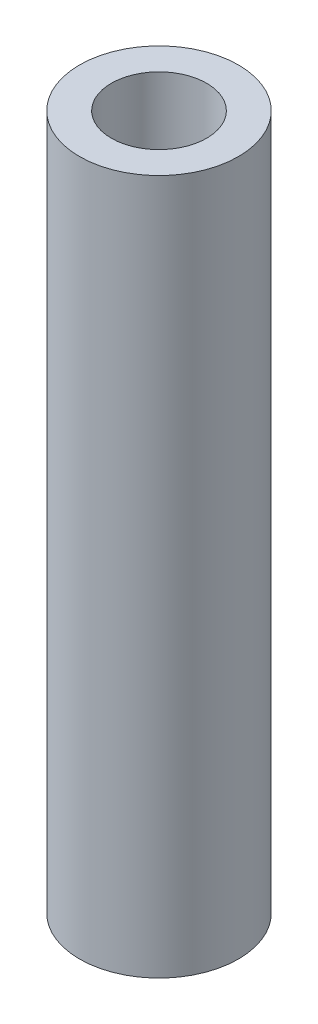
ISO-10303-21;
HEADER;
FILE_DESCRIPTION(('STEP AP214'),'2;1');
FILE_NAME('part.step','',(''),(''),'','','');
FILE_SCHEMA(('AUTOMOTIVE_DESIGN { 1 0 10303 214 1 1 1 1 }'));
ENDSEC;
DATA;
#1=APPLICATION_CONTEXT('core data for automotive mechanical design processes');
#2=APPLICATION_PROTOCOL_DEFINITION('international standard','automotive_design',2000,#1);
#3=PRODUCT_CONTEXT('',#1,'mechanical');
#4=PRODUCT('Part','Part','',(#3));
#5=PRODUCT_RELATED_PRODUCT_CATEGORY('part','',(#4));
#6=PRODUCT_DEFINITION_FORMATION('','',#4);
#7=PRODUCT_DEFINITION_CONTEXT('part definition',#1,'design');
#8=PRODUCT_DEFINITION('design','',#6,#7);
#9=PRODUCT_DEFINITION_SHAPE('','',#8);
#10=(LENGTH_UNIT() NAMED_UNIT(*) SI_UNIT(.MILLI.,.METRE.));
#11=(NAMED_UNIT(*) PLANE_ANGLE_UNIT() SI_UNIT($,.RADIAN.));
#12=(NAMED_UNIT(*) SI_UNIT($,.STERADIAN.) SOLID_ANGLE_UNIT());
#13=UNCERTAINTY_MEASURE_WITH_UNIT(LENGTH_MEASURE(1.E-05),#10,'distance_accuracy_value','');
#14=(GEOMETRIC_REPRESENTATION_CONTEXT(3) GLOBAL_UNCERTAINTY_ASSIGNED_CONTEXT((#13)) GLOBAL_UNIT_ASSIGNED_CONTEXT((#10,
#11,#12)) REPRESENTATION_CONTEXT('',''));
#15=CARTESIAN_POINT('',(0.,0.,0.));
#16=DIRECTION('',(0.,0.,1.));
#17=DIRECTION('',(1.,0.,0.));
#18=AXIS2_PLACEMENT_3D('',#15,#16,#17);
#19=CARTESIAN_POINT('',(0.,35.,0.));
#20=DIRECTION('',(0.,1.,0.));
#21=DIRECTION('',(0.,0.,1.));
#22=AXIS2_PLACEMENT_3D('',#19,#20,#21);
#23=PLANE('',#22);
#24=CARTESIAN_POINT('',(0.,35.,0.));
#25=DIRECTION('',(0.,1.,0.));
#26=DIRECTION('',(0.,0.,1.));
#27=AXIS2_PLACEMENT_3D('',#24,#25,#26);
#28=CIRCLE('',#27,4.);
#29=CARTESIAN_POINT('',(0.,35.,4.));
#30=VERTEX_POINT('',#29);
#31=EDGE_CURVE('E10',#30,#30,#28,.T.);
#32=ORIENTED_EDGE('',*,*,#31,.T.);
#33=EDGE_LOOP('',(#32));
#34=FACE_BOUND('',#33,.T.);
#35=CARTESIAN_POINT('',(0.,35.,0.));
#36=DIRECTION('',(0.,1.,0.));
#37=DIRECTION('',(0.,0.,1.));
#38=AXIS2_PLACEMENT_3D('',#35,#36,#37);
#39=CIRCLE('',#38,2.4);
#40=CARTESIAN_POINT('',(0.,35.,2.4));
#41=VERTEX_POINT('',#40);
#42=EDGE_CURVE('E50',#41,#41,#39,.T.);
#43=ORIENTED_EDGE('',*,*,#42,.F.);
#44=EDGE_LOOP('',(#43));
#45=FACE_BOUND('',#44,.T.);
#46=ADVANCED_FACE('F37',(#34,#45),#23,.T.);
#47=CARTESIAN_POINT('',(0.,0.,0.));
#48=DIRECTION('',(0.,1.,0.));
#49=DIRECTION('',(0.,0.,1.));
#50=AXIS2_PLACEMENT_3D('',#47,#48,#49);
#51=PLANE('',#50);
#52=CARTESIAN_POINT('',(0.,0.,0.));
#53=DIRECTION('',(0.,1.,0.));
#54=DIRECTION('',(0.,0.,1.));
#55=AXIS2_PLACEMENT_3D('',#52,#53,#54);
#56=CIRCLE('',#55,4.);
#57=CARTESIAN_POINT('',(0.,0.,4.));
#58=VERTEX_POINT('',#57);
#59=EDGE_CURVE('E41',#58,#58,#56,.T.);
#60=ORIENTED_EDGE('',*,*,#59,.F.);
#61=EDGE_LOOP('',(#60));
#62=FACE_BOUND('',#61,.T.);
#63=CARTESIAN_POINT('',(0.,0.,0.));
#64=DIRECTION('',(0.,1.,0.));
#65=DIRECTION('',(0.,0.,1.));
#66=AXIS2_PLACEMENT_3D('',#63,#64,#65);
#67=CIRCLE('',#66,2.4);
#68=CARTESIAN_POINT('',(0.,0.,2.4));
#69=VERTEX_POINT('',#68);
#70=EDGE_CURVE('E52',#69,#69,#67,.T.);
#71=ORIENTED_EDGE('',*,*,#70,.T.);
#72=EDGE_LOOP('',(#71));
#73=FACE_BOUND('',#72,.T.);
#74=ADVANCED_FACE('F64',(#62,#73),#51,.F.);
#75=CARTESIAN_POINT('',(0.,35.,0.));
#76=DIRECTION('',(0.,-1.,0.));
#77=DIRECTION('',(0.,0.,-1.));
#78=AXIS2_PLACEMENT_3D('',#75,#76,#77);
#79=CYLINDRICAL_SURFACE('',#78,4.);
#80=ORIENTED_EDGE('',*,*,#31,.F.);
#81=EDGE_LOOP('',(#80));
#82=FACE_BOUND('',#81,.T.);
#83=ORIENTED_EDGE('',*,*,#59,.T.);
#84=EDGE_LOOP('',(#83));
#85=FACE_BOUND('',#84,.T.);
#86=ADVANCED_FACE('F39',(#82,#85),#79,.T.);
#87=CARTESIAN_POINT('',(0.,35.,0.));
#88=DIRECTION('',(0.,-1.,0.));
#89=DIRECTION('',(0.,0.,-1.));
#90=AXIS2_PLACEMENT_3D('',#87,#88,#89);
#91=CYLINDRICAL_SURFACE('',#90,2.4);
#92=ORIENTED_EDGE('',*,*,#42,.T.);
#93=EDGE_LOOP('',(#92));
#94=FACE_BOUND('',#93,.T.);
#95=ORIENTED_EDGE('',*,*,#70,.F.);
#96=EDGE_LOOP('',(#95));
#97=FACE_BOUND('',#96,.T.);
#98=ADVANCED_FACE('F60',(#94,#97),#91,.F.);
#99=CLOSED_SHELL('',(#46,#74,#86,#98));
#100=MANIFOLD_SOLID_BREP('B2',#99);
#101=ADVANCED_BREP_SHAPE_REPRESENTATION('',(#18,#100),#14);
#102=SHAPE_DEFINITION_REPRESENTATION(#9,#101);
ENDSEC;
END-ISO-10303-21;
